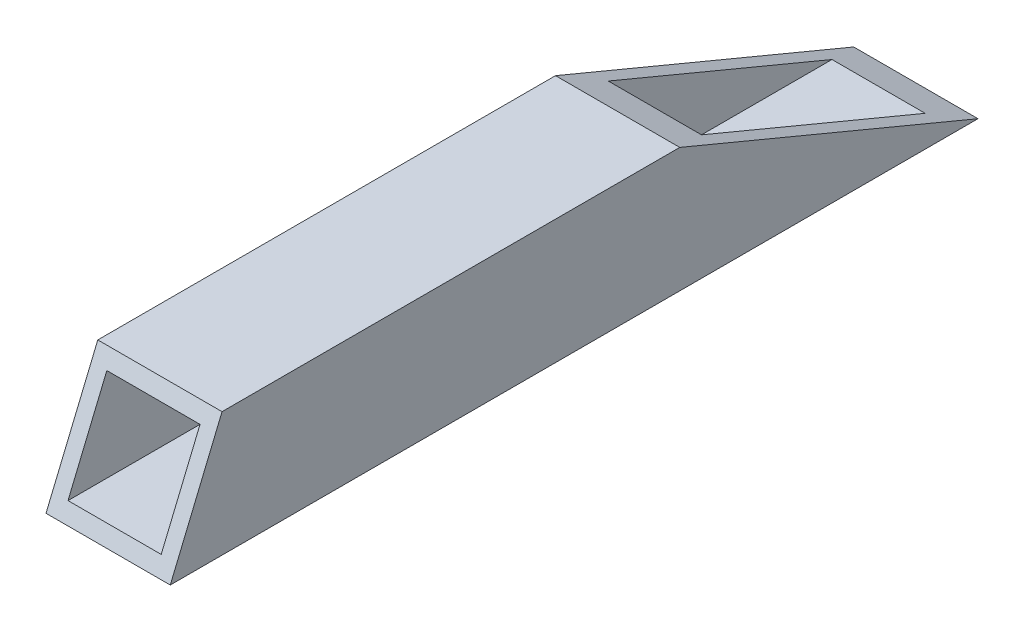
ISO-10303-21;
HEADER;
FILE_DESCRIPTION(('STEP AP214'),'2;1');
FILE_NAME('part.step','',(''),(''),'','','');
FILE_SCHEMA(('AUTOMOTIVE_DESIGN { 1 0 10303 214 1 1 1 1 }'));
ENDSEC;
DATA;
#1=APPLICATION_CONTEXT('core data for automotive mechanical design processes');
#2=APPLICATION_PROTOCOL_DEFINITION('international standard','automotive_design',2000,#1);
#3=PRODUCT_CONTEXT('',#1,'mechanical');
#4=PRODUCT('Part','Part','',(#3));
#5=PRODUCT_RELATED_PRODUCT_CATEGORY('part','',(#4));
#6=PRODUCT_DEFINITION_FORMATION('','',#4);
#7=PRODUCT_DEFINITION_CONTEXT('part definition',#1,'design');
#8=PRODUCT_DEFINITION('design','',#6,#7);
#9=PRODUCT_DEFINITION_SHAPE('','',#8);
#10=(LENGTH_UNIT() NAMED_UNIT(*) SI_UNIT(.MILLI.,.METRE.));
#11=(NAMED_UNIT(*) PLANE_ANGLE_UNIT() SI_UNIT($,.RADIAN.));
#12=(NAMED_UNIT(*) SI_UNIT($,.STERADIAN.) SOLID_ANGLE_UNIT());
#13=UNCERTAINTY_MEASURE_WITH_UNIT(LENGTH_MEASURE(1.E-05),#10,'distance_accuracy_value','');
#14=(GEOMETRIC_REPRESENTATION_CONTEXT(3) GLOBAL_UNCERTAINTY_ASSIGNED_CONTEXT((#13)) GLOBAL_UNIT_ASSIGNED_CONTEXT((#10,
#11,#12)) REPRESENTATION_CONTEXT('',''));
#15=CARTESIAN_POINT('',(0.,0.,0.));
#16=DIRECTION('',(0.,0.,1.));
#17=DIRECTION('',(1.,0.,0.));
#18=AXIS2_PLACEMENT_3D('',#15,#16,#17);
#19=CARTESIAN_POINT('',(0.,0.,165.1));
#20=DIRECTION('',(1.,0.,0.));
#21=DIRECTION('',(0.,0.,-1.));
#22=AXIS2_PLACEMENT_3D('',#19,#20,#21);
#23=PLANE('',#22);
#24=DIRECTION('',(0.,0.,-1.));
#25=VECTOR('',#24,1.);
#26=CARTESIAN_POINT('',(0.,25.4,165.1));
#27=LINE('',#26,#25);
#28=CARTESIAN_POINT('',(0.,25.4,154.516596402061));
#29=VERTEX_POINT('',#28);
#30=CARTESIAN_POINT('',(0.,25.4,60.9595952785587));
#31=VERTEX_POINT('',#30);
#32=EDGE_CURVE('E115',#29,#31,#27,.T.);
#33=ORIENTED_EDGE('',*,*,#32,.T.);
#34=DIRECTION('',(0.,0.384617560400181,0.923076016496915));
#35=VECTOR('',#34,1.);
#36=CARTESIAN_POINT('',(0.,0.,0.));
#37=LINE('',#36,#35);
#38=CARTESIAN_POINT('',(0.,0.,0.));
#39=VERTEX_POINT('',#38);
#40=EDGE_CURVE('E47',#39,#31,#37,.T.);
#41=ORIENTED_EDGE('',*,*,#40,.F.);
#42=DIRECTION('',(0.,0.,-1.));
#43=VECTOR('',#42,1.);
#44=CARTESIAN_POINT('',(0.,0.,165.1));
#45=LINE('',#44,#43);
#46=CARTESIAN_POINT('',(0.,0.,165.1));
#47=VERTEX_POINT('',#46);
#48=EDGE_CURVE('E117',#47,#39,#45,.T.);
#49=ORIENTED_EDGE('',*,*,#48,.F.);
#50=DIRECTION('',(0.,-0.923076016496914,0.384617560400184));
#51=VECTOR('',#50,1.);
#52=CARTESIAN_POINT('',(0.,0.,165.1));
#53=LINE('',#52,#51);
#54=EDGE_CURVE('E145',#29,#47,#53,.T.);
#55=ORIENTED_EDGE('',*,*,#54,.F.);
#56=EDGE_LOOP('',(#33,#41,#49,#55));
#57=FACE_BOUND('',#56,.T.);
#58=ADVANCED_FACE('F33',(#57),#23,.F.);
#59=CARTESIAN_POINT('',(0.,0.,165.1));
#60=DIRECTION('',(0.,1.,0.));
#61=DIRECTION('',(0.,0.,1.));
#62=AXIS2_PLACEMENT_3D('',#59,#60,#61);
#63=PLANE('',#62);
#64=DIRECTION('',(1.,0.,0.));
#65=VECTOR('',#64,1.);
#66=CARTESIAN_POINT('',(0.,0.,0.));
#67=LINE('',#66,#65);
#68=CARTESIAN_POINT('',(25.4,0.,0.));
#69=VERTEX_POINT('',#68);
#70=EDGE_CURVE('E157',#39,#69,#67,.T.);
#71=ORIENTED_EDGE('',*,*,#70,.T.);
#72=DIRECTION('',(0.,0.,-1.));
#73=VECTOR('',#72,1.);
#74=CARTESIAN_POINT('',(25.4,0.,165.1));
#75=LINE('',#74,#73);
#76=CARTESIAN_POINT('',(25.4,0.,165.1));
#77=VERTEX_POINT('',#76);
#78=EDGE_CURVE('E110',#77,#69,#75,.T.);
#79=ORIENTED_EDGE('',*,*,#78,.F.);
#80=DIRECTION('',(1.,0.,0.));
#81=VECTOR('',#80,1.);
#82=CARTESIAN_POINT('',(0.,0.,165.1));
#83=LINE('',#82,#81);
#84=EDGE_CURVE('E119',#47,#77,#83,.T.);
#85=ORIENTED_EDGE('',*,*,#84,.F.);
#86=ORIENTED_EDGE('',*,*,#48,.T.);
#87=EDGE_LOOP('',(#71,#79,#85,#86));
#88=FACE_BOUND('',#87,.T.);
#89=ADVANCED_FACE('F159',(#88),#63,.F.);
#90=CARTESIAN_POINT('',(25.4,0.,165.1));
#91=DIRECTION('',(-1.,0.,0.));
#92=DIRECTION('',(0.,-1.,0.));
#93=AXIS2_PLACEMENT_3D('',#90,#91,#92);
#94=PLANE('',#93);
#95=ORIENTED_EDGE('',*,*,#78,.T.);
#96=DIRECTION('',(0.,-0.384617560400181,-0.923076016496915));
#97=VECTOR('',#96,1.);
#98=CARTESIAN_POINT('',(25.4,0.,0.));
#99=LINE('',#98,#97);
#100=CARTESIAN_POINT('',(25.4,25.4,60.9595952785587));
#101=VERTEX_POINT('',#100);
#102=EDGE_CURVE('E96',#101,#69,#99,.T.);
#103=ORIENTED_EDGE('',*,*,#102,.F.);
#104=DIRECTION('',(0.,0.,-1.));
#105=VECTOR('',#104,1.);
#106=CARTESIAN_POINT('',(25.4,25.4,165.1));
#107=LINE('',#106,#105);
#108=CARTESIAN_POINT('',(25.4,25.4,154.516596402061));
#109=VERTEX_POINT('',#108);
#110=EDGE_CURVE('E108',#109,#101,#107,.T.);
#111=ORIENTED_EDGE('',*,*,#110,.F.);
#112=DIRECTION('',(0.,0.923076016496914,-0.384617560400184));
#113=VECTOR('',#112,1.);
#114=CARTESIAN_POINT('',(25.4,0.,165.1));
#115=LINE('',#114,#113);
#116=EDGE_CURVE('E171',#77,#109,#115,.T.);
#117=ORIENTED_EDGE('',*,*,#116,.F.);
#118=EDGE_LOOP('',(#95,#103,#111,#117));
#119=FACE_BOUND('',#118,.T.);
#120=ADVANCED_FACE('F106',(#119),#94,.F.);
#121=CARTESIAN_POINT('',(0.,25.4,165.1));
#122=DIRECTION('',(0.,-1.,0.));
#123=DIRECTION('',(0.,0.,-1.));
#124=AXIS2_PLACEMENT_3D('',#121,#122,#123);
#125=PLANE('',#124);
#126=ORIENTED_EDGE('',*,*,#110,.T.);
#127=DIRECTION('',(1.,0.,0.));
#128=VECTOR('',#127,1.);
#129=CARTESIAN_POINT('',(-66.0396264111607,25.4,60.9595952785587));
#130=LINE('',#129,#128);
#131=EDGE_CURVE('E93',#31,#101,#130,.T.);
#132=ORIENTED_EDGE('',*,*,#131,.F.);
#133=ORIENTED_EDGE('',*,*,#32,.F.);
#134=DIRECTION('',(1.,0.,0.));
#135=VECTOR('',#134,1.);
#136=CARTESIAN_POINT('',(-66.0396264111607,25.4,154.516596402061));
#137=LINE('',#136,#135);
#138=EDGE_CURVE('E114',#29,#109,#137,.T.);
#139=ORIENTED_EDGE('',*,*,#138,.T.);
#140=EDGE_LOOP('',(#126,#132,#133,#139));
#141=FACE_BOUND('',#140,.T.);
#142=ADVANCED_FACE('F113',(#141),#125,.F.);
#143=CARTESIAN_POINT('',(3.175,22.225,165.1));
#144=DIRECTION('',(1.,0.,0.));
#145=DIRECTION('',(0.,1.,0.));
#146=AXIS2_PLACEMENT_3D('',#143,#144,#145);
#147=PLANE('',#146);
#148=DIRECTION('',(0.,-0.384617560400181,-0.923076016496915));
#149=VECTOR('',#148,1.);
#150=CARTESIAN_POINT('',(3.175,61.9034177279793,148.567216183354));
#151=LINE('',#150,#149);
#152=CARTESIAN_POINT('',(3.175,22.225,53.3396458687389));
#153=VERTEX_POINT('',#152);
#154=CARTESIAN_POINT('',(3.175,3.175,7.61994940981986));
#155=VERTEX_POINT('',#154);
#156=EDGE_CURVE('E169',#153,#155,#151,.T.);
#157=ORIENTED_EDGE('',*,*,#156,.F.);
#158=DIRECTION('',(0.,0.,-1.));
#159=VECTOR('',#158,1.);
#160=CARTESIAN_POINT('',(3.175,22.225,165.1));
#161=LINE('',#160,#159);
#162=CARTESIAN_POINT('',(3.175,22.225,155.839521851803));
#163=VERTEX_POINT('',#162);
#164=EDGE_CURVE('E148',#163,#153,#161,.T.);
#165=ORIENTED_EDGE('',*,*,#164,.F.);
#166=DIRECTION('',(0.,0.923076016496914,-0.384617560400184));
#167=VECTOR('',#166,1.);
#168=CARTESIAN_POINT('',(3.175,18.937240908852,157.209430568119));
#169=LINE('',#168,#167);
#170=CARTESIAN_POINT('',(3.175,3.175,163.777074550258));
#171=VERTEX_POINT('',#170);
#172=EDGE_CURVE('E132',#171,#163,#169,.T.);
#173=ORIENTED_EDGE('',*,*,#172,.F.);
#174=DIRECTION('',(0.,0.,-1.));
#175=VECTOR('',#174,1.);
#176=CARTESIAN_POINT('',(3.175,3.175,165.1));
#177=LINE('',#176,#175);
#178=EDGE_CURVE('E150',#171,#155,#177,.T.);
#179=ORIENTED_EDGE('',*,*,#178,.T.);
#180=EDGE_LOOP('',(#157,#165,#173,#179));
#181=FACE_BOUND('',#180,.T.);
#182=ADVANCED_FACE('F179',(#181),#147,.T.);
#183=CARTESIAN_POINT('',(3.175,3.175,165.1));
#184=DIRECTION('',(0.,1.,0.));
#185=DIRECTION('',(0.,0.,1.));
#186=AXIS2_PLACEMENT_3D('',#183,#184,#185);
#187=PLANE('',#186);
#188=DIRECTION('',(1.,0.,0.));
#189=VECTOR('',#188,1.);
#190=CARTESIAN_POINT('',(3.1749999999999,3.175,7.61994940981986));
#191=LINE('',#190,#189);
#192=CARTESIAN_POINT('',(22.225,3.17499999999999,7.61994940981983));
#193=VERTEX_POINT('',#192);
#194=EDGE_CURVE('E165',#155,#193,#191,.T.);
#195=ORIENTED_EDGE('',*,*,#194,.F.);
#196=ORIENTED_EDGE('',*,*,#178,.F.);
#197=DIRECTION('',(-1.,0.,0.));
#198=VECTOR('',#197,1.);
#199=CARTESIAN_POINT('',(3.175,3.175,163.777074550258));
#200=LINE('',#199,#198);
#201=CARTESIAN_POINT('',(22.225,3.175,163.777074550258));
#202=VERTEX_POINT('',#201);
#203=EDGE_CURVE('E144',#202,#171,#200,.T.);
#204=ORIENTED_EDGE('',*,*,#203,.F.);
#205=DIRECTION('',(0.,0.,-1.));
#206=VECTOR('',#205,1.);
#207=CARTESIAN_POINT('',(22.225,3.175,165.1));
#208=LINE('',#207,#206);
#209=EDGE_CURVE('E143',#202,#193,#208,.T.);
#210=ORIENTED_EDGE('',*,*,#209,.T.);
#211=EDGE_LOOP('',(#195,#196,#204,#210));
#212=FACE_BOUND('',#211,.T.);
#213=ADVANCED_FACE('F181',(#212),#187,.T.);
#214=CARTESIAN_POINT('',(22.225,22.225,165.1));
#215=DIRECTION('',(-1.,0.,0.));
#216=DIRECTION('',(0.,-1.,0.));
#217=AXIS2_PLACEMENT_3D('',#214,#215,#216);
#218=PLANE('',#217);
#219=DIRECTION('',(0.,0.384617560400181,0.923076016496915));
#220=VECTOR('',#219,1.);
#221=CARTESIAN_POINT('',(22.225,61.9034177279793,148.567216183354));
#222=LINE('',#221,#220);
#223=CARTESIAN_POINT('',(22.225,22.225,53.3396458687389));
#224=VERTEX_POINT('',#223);
#225=EDGE_CURVE('E54',#193,#224,#222,.T.);
#226=ORIENTED_EDGE('',*,*,#225,.F.);
#227=ORIENTED_EDGE('',*,*,#209,.F.);
#228=DIRECTION('',(0.,-0.923076016496914,0.384617560400184));
#229=VECTOR('',#228,1.);
#230=CARTESIAN_POINT('',(22.225,18.937240908852,157.209430568119));
#231=LINE('',#230,#229);
#232=CARTESIAN_POINT('',(22.225,22.225,155.839521851803));
#233=VERTEX_POINT('',#232);
#234=EDGE_CURVE('E129',#233,#202,#231,.T.);
#235=ORIENTED_EDGE('',*,*,#234,.F.);
#236=DIRECTION('',(0.,0.,-1.));
#237=VECTOR('',#236,1.);
#238=CARTESIAN_POINT('',(22.225,22.225,165.1));
#239=LINE('',#238,#237);
#240=EDGE_CURVE('E141',#233,#224,#239,.T.);
#241=ORIENTED_EDGE('',*,*,#240,.T.);
#242=EDGE_LOOP('',(#226,#227,#235,#241));
#243=FACE_BOUND('',#242,.T.);
#244=ADVANCED_FACE('F140',(#243),#218,.T.);
#245=CARTESIAN_POINT('',(3.175,22.225,165.1));
#246=DIRECTION('',(0.,-1.,0.));
#247=DIRECTION('',(0.,0.,-1.));
#248=AXIS2_PLACEMENT_3D('',#245,#246,#247);
#249=PLANE('',#248);
#250=DIRECTION('',(-1.,0.,0.));
#251=VECTOR('',#250,1.);
#252=CARTESIAN_POINT('',(3.17499999999993,22.225,53.3396458687389));
#253=LINE('',#252,#251);
#254=EDGE_CURVE('E11',#224,#153,#253,.T.);
#255=ORIENTED_EDGE('',*,*,#254,.F.);
#256=ORIENTED_EDGE('',*,*,#240,.F.);
#257=DIRECTION('',(1.,0.,0.));
#258=VECTOR('',#257,1.);
#259=CARTESIAN_POINT('',(3.175,22.225,155.839521851803));
#260=LINE('',#259,#258);
#261=EDGE_CURVE('E40',#163,#233,#260,.T.);
#262=ORIENTED_EDGE('',*,*,#261,.F.);
#263=ORIENTED_EDGE('',*,*,#164,.T.);
#264=EDGE_LOOP('',(#255,#256,#262,#263));
#265=FACE_BOUND('',#264,.T.);
#266=ADVANCED_FACE('F147',(#265),#249,.T.);
#267=CARTESIAN_POINT('',(-66.0396264111607,0.,165.1));
#268=DIRECTION('',(0.,-0.384617560400184,-0.923076016496914));
#269=DIRECTION('',(0.,0.923076016496914,-0.384617560400184));
#270=AXIS2_PLACEMENT_3D('',#267,#268,#269);
#271=PLANE('',#270);
#272=ORIENTED_EDGE('',*,*,#172,.T.);
#273=ORIENTED_EDGE('',*,*,#261,.T.);
#274=ORIENTED_EDGE('',*,*,#234,.T.);
#275=ORIENTED_EDGE('',*,*,#203,.T.);
#276=EDGE_LOOP('',(#272,#273,#274,#275));
#277=FACE_BOUND('',#276,.T.);
#278=ORIENTED_EDGE('',*,*,#54,.T.);
#279=ORIENTED_EDGE('',*,*,#84,.T.);
#280=ORIENTED_EDGE('',*,*,#116,.T.);
#281=ORIENTED_EDGE('',*,*,#138,.F.);
#282=EDGE_LOOP('',(#278,#279,#280,#281));
#283=FACE_BOUND('',#282,.T.);
#284=ADVANCED_FACE('F127',(#277,#283),#271,.F.);
#285=CARTESIAN_POINT('',(-66.0396264111607,0.,0.));
#286=DIRECTION('',(0.,-0.923076016496915,0.384617560400181));
#287=DIRECTION('',(0.,-0.384617560400181,-0.923076016496915));
#288=AXIS2_PLACEMENT_3D('',#285,#286,#287);
#289=PLANE('',#288);
#290=ORIENTED_EDGE('',*,*,#156,.T.);
#291=ORIENTED_EDGE('',*,*,#194,.T.);
#292=ORIENTED_EDGE('',*,*,#225,.T.);
#293=ORIENTED_EDGE('',*,*,#254,.T.);
#294=EDGE_LOOP('',(#290,#291,#292,#293));
#295=FACE_BOUND('',#294,.T.);
#296=ORIENTED_EDGE('',*,*,#40,.T.);
#297=ORIENTED_EDGE('',*,*,#131,.T.);
#298=ORIENTED_EDGE('',*,*,#102,.T.);
#299=ORIENTED_EDGE('',*,*,#70,.F.);
#300=EDGE_LOOP('',(#296,#297,#298,#299));
#301=FACE_BOUND('',#300,.T.);
#302=ADVANCED_FACE('F95',(#295,#301),#289,.F.);
#303=CLOSED_SHELL('',(#58,#89,#120,#142,#182,#213,#244,#266,#284,#302));
#304=MANIFOLD_SOLID_BREP('B2',#303);
#305=ADVANCED_BREP_SHAPE_REPRESENTATION('',(#18,#304),#14);
#306=SHAPE_DEFINITION_REPRESENTATION(#9,#305);
ENDSEC;
END-ISO-10303-21;
